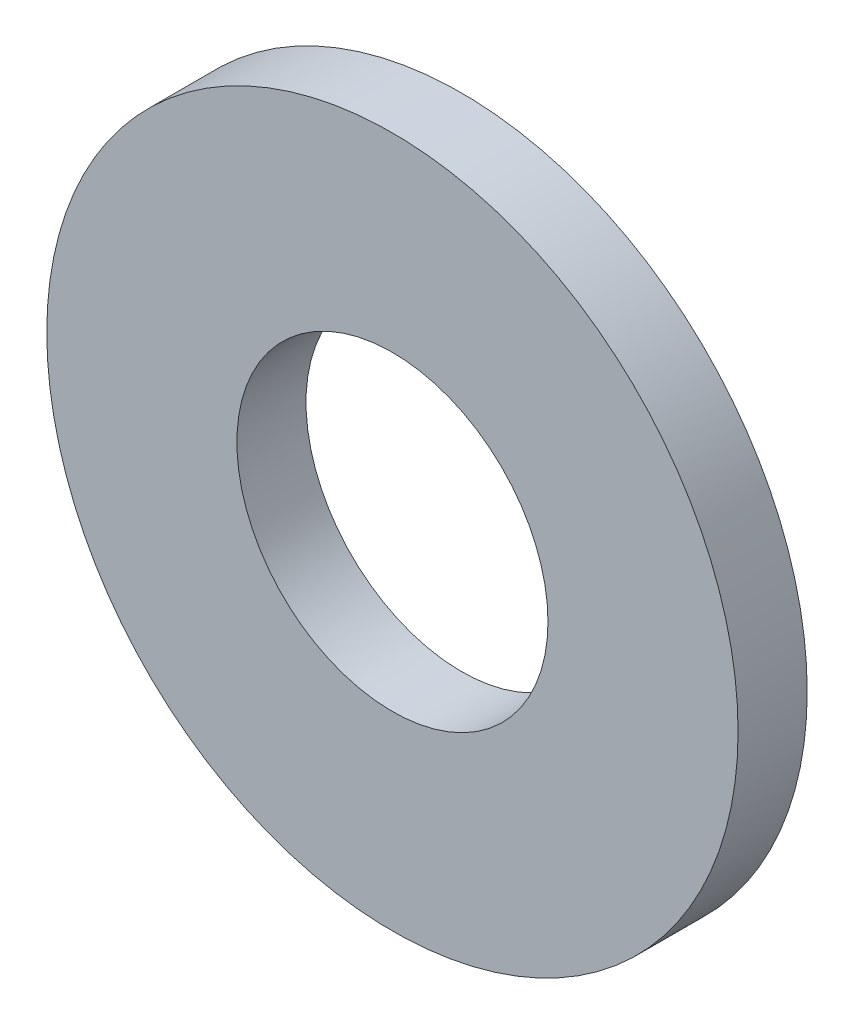
ISO-10303-21;
HEADER;
FILE_DESCRIPTION(('STEP AP214'),'2;1');
FILE_NAME('part.step','',(''),(''),'','','');
FILE_SCHEMA(('AUTOMOTIVE_DESIGN { 1 0 10303 214 1 1 1 1 }'));
ENDSEC;
DATA;
#1=APPLICATION_CONTEXT('core data for automotive mechanical design processes');
#2=APPLICATION_PROTOCOL_DEFINITION('international standard','automotive_design',2000,#1);
#3=PRODUCT_CONTEXT('',#1,'mechanical');
#4=PRODUCT('Part','Part','',(#3));
#5=PRODUCT_RELATED_PRODUCT_CATEGORY('part','',(#4));
#6=PRODUCT_DEFINITION_FORMATION('','',#4);
#7=PRODUCT_DEFINITION_CONTEXT('part definition',#1,'design');
#8=PRODUCT_DEFINITION('design','',#6,#7);
#9=PRODUCT_DEFINITION_SHAPE('','',#8);
#10=(LENGTH_UNIT() NAMED_UNIT(*) SI_UNIT(.MILLI.,.METRE.));
#11=(NAMED_UNIT(*) PLANE_ANGLE_UNIT() SI_UNIT($,.RADIAN.));
#12=(NAMED_UNIT(*) SI_UNIT($,.STERADIAN.) SOLID_ANGLE_UNIT());
#13=UNCERTAINTY_MEASURE_WITH_UNIT(LENGTH_MEASURE(1.E-05),#10,'distance_accuracy_value','');
#14=(GEOMETRIC_REPRESENTATION_CONTEXT(3) GLOBAL_UNCERTAINTY_ASSIGNED_CONTEXT((#13)) GLOBAL_UNIT_ASSIGNED_CONTEXT((#10,
#11,#12)) REPRESENTATION_CONTEXT('',''));
#15=CARTESIAN_POINT('',(0.,0.,0.));
#16=DIRECTION('',(0.,0.,1.));
#17=DIRECTION('',(1.,0.,0.));
#18=AXIS2_PLACEMENT_3D('',#15,#16,#17);
#19=CARTESIAN_POINT('',(0.,0.,0.6));
#20=DIRECTION('',(0.,0.,1.));
#21=DIRECTION('',(1.,0.,0.));
#22=AXIS2_PLACEMENT_3D('',#19,#20,#21);
#23=PLANE('',#22);
#24=CARTESIAN_POINT('',(0.,0.,0.6));
#25=DIRECTION('',(0.,0.,1.));
#26=DIRECTION('',(1.,0.,0.));
#27=AXIS2_PLACEMENT_3D('',#24,#25,#26);
#28=CIRCLE('',#27,3.);
#29=CARTESIAN_POINT('',(3.,0.,0.6));
#30=VERTEX_POINT('',#29);
#31=EDGE_CURVE('E10',#30,#30,#28,.T.);
#32=ORIENTED_EDGE('',*,*,#31,.T.);
#33=EDGE_LOOP('',(#32));
#34=FACE_BOUND('',#33,.T.);
#35=CARTESIAN_POINT('',(0.,0.,0.6));
#36=DIRECTION('',(0.,0.,1.));
#37=DIRECTION('',(1.,0.,0.));
#38=AXIS2_PLACEMENT_3D('',#35,#36,#37);
#39=CIRCLE('',#38,1.35);
#40=CARTESIAN_POINT('',(1.35,0.,0.6));
#41=VERTEX_POINT('',#40);
#42=EDGE_CURVE('E41',#41,#41,#39,.T.);
#43=ORIENTED_EDGE('',*,*,#42,.F.);
#44=EDGE_LOOP('',(#43));
#45=FACE_BOUND('',#44,.T.);
#46=ADVANCED_FACE('F30',(#34,#45),#23,.T.);
#47=CARTESIAN_POINT('',(0.,0.,0.));
#48=DIRECTION('',(0.,0.,1.));
#49=DIRECTION('',(1.,0.,0.));
#50=AXIS2_PLACEMENT_3D('',#47,#48,#49);
#51=PLANE('',#50);
#52=CARTESIAN_POINT('',(0.,0.,0.));
#53=DIRECTION('',(0.,0.,1.));
#54=DIRECTION('',(1.,0.,0.));
#55=AXIS2_PLACEMENT_3D('',#52,#53,#54);
#56=CIRCLE('',#55,3.);
#57=CARTESIAN_POINT('',(3.,0.,0.));
#58=VERTEX_POINT('',#57);
#59=EDGE_CURVE('E34',#58,#58,#56,.T.);
#60=ORIENTED_EDGE('',*,*,#59,.F.);
#61=EDGE_LOOP('',(#60));
#62=FACE_BOUND('',#61,.T.);
#63=CARTESIAN_POINT('',(0.,0.,0.));
#64=DIRECTION('',(0.,0.,1.));
#65=DIRECTION('',(1.,0.,0.));
#66=AXIS2_PLACEMENT_3D('',#63,#64,#65);
#67=CIRCLE('',#66,1.35);
#68=CARTESIAN_POINT('',(1.35,0.,0.));
#69=VERTEX_POINT('',#68);
#70=EDGE_CURVE('E43',#69,#69,#67,.T.);
#71=ORIENTED_EDGE('',*,*,#70,.T.);
#72=EDGE_LOOP('',(#71));
#73=FACE_BOUND('',#72,.T.);
#74=ADVANCED_FACE('F53',(#62,#73),#51,.F.);
#75=CARTESIAN_POINT('',(0.,0.,0.6));
#76=DIRECTION('',(0.,0.,-1.));
#77=DIRECTION('',(-1.,0.,0.));
#78=AXIS2_PLACEMENT_3D('',#75,#76,#77);
#79=CYLINDRICAL_SURFACE('',#78,3.);
#80=ORIENTED_EDGE('',*,*,#31,.F.);
#81=EDGE_LOOP('',(#80));
#82=FACE_BOUND('',#81,.T.);
#83=ORIENTED_EDGE('',*,*,#59,.T.);
#84=EDGE_LOOP('',(#83));
#85=FACE_BOUND('',#84,.T.);
#86=ADVANCED_FACE('F32',(#82,#85),#79,.T.);
#87=CARTESIAN_POINT('',(0.,0.,0.6));
#88=DIRECTION('',(0.,0.,-1.));
#89=DIRECTION('',(-1.,0.,0.));
#90=AXIS2_PLACEMENT_3D('',#87,#88,#89);
#91=CYLINDRICAL_SURFACE('',#90,1.35);
#92=ORIENTED_EDGE('',*,*,#42,.T.);
#93=EDGE_LOOP('',(#92));
#94=FACE_BOUND('',#93,.T.);
#95=ORIENTED_EDGE('',*,*,#70,.F.);
#96=EDGE_LOOP('',(#95));
#97=FACE_BOUND('',#96,.T.);
#98=ADVANCED_FACE('F49',(#94,#97),#91,.F.);
#99=CLOSED_SHELL('',(#46,#74,#86,#98));
#100=MANIFOLD_SOLID_BREP('B2',#99);
#101=ADVANCED_BREP_SHAPE_REPRESENTATION('',(#18,#100),#14);
#102=SHAPE_DEFINITION_REPRESENTATION(#9,#101);
ENDSEC;
END-ISO-10303-21;
